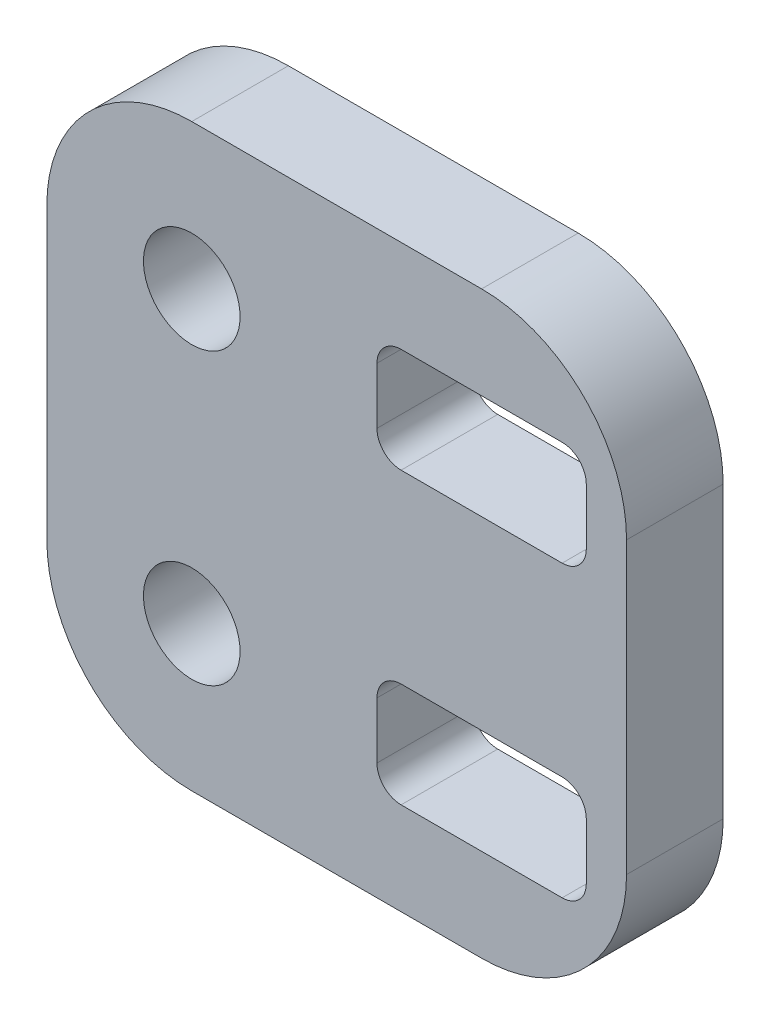
ISO-10303-21;
HEADER;
FILE_DESCRIPTION(('STEP AP214'),'2;1');
FILE_NAME('part.step','',(''),(''),'','','');
FILE_SCHEMA(('AUTOMOTIVE_DESIGN { 1 0 10303 214 1 1 1 1 }'));
ENDSEC;
DATA;
#1=APPLICATION_CONTEXT('core data for automotive mechanical design processes');
#2=APPLICATION_PROTOCOL_DEFINITION('international standard','automotive_design',2000,#1);
#3=PRODUCT_CONTEXT('',#1,'mechanical');
#4=PRODUCT('Part','Part','',(#3));
#5=PRODUCT_RELATED_PRODUCT_CATEGORY('part','',(#4));
#6=PRODUCT_DEFINITION_FORMATION('','',#4);
#7=PRODUCT_DEFINITION_CONTEXT('part definition',#1,'design');
#8=PRODUCT_DEFINITION('design','',#6,#7);
#9=PRODUCT_DEFINITION_SHAPE('','',#8);
#10=(LENGTH_UNIT() NAMED_UNIT(*) SI_UNIT(.MILLI.,.METRE.));
#11=(NAMED_UNIT(*) PLANE_ANGLE_UNIT() SI_UNIT($,.RADIAN.));
#12=(NAMED_UNIT(*) SI_UNIT($,.STERADIAN.) SOLID_ANGLE_UNIT());
#13=UNCERTAINTY_MEASURE_WITH_UNIT(LENGTH_MEASURE(1.E-05),#10,'distance_accuracy_value','');
#14=(GEOMETRIC_REPRESENTATION_CONTEXT(3) GLOBAL_UNCERTAINTY_ASSIGNED_CONTEXT((#13)) GLOBAL_UNIT_ASSIGNED_CONTEXT((#10,
#11,#12)) REPRESENTATION_CONTEXT('',''));
#15=CARTESIAN_POINT('',(0.,0.,0.));
#16=DIRECTION('',(0.,0.,1.));
#17=DIRECTION('',(1.,0.,0.));
#18=AXIS2_PLACEMENT_3D('',#15,#16,#17);
#19=CARTESIAN_POINT('',(204.3359221937,165.8331963046,3.));
#20=DIRECTION('',(0.,0.,1.));
#21=DIRECTION('',(1.,0.,0.));
#22=AXIS2_PLACEMENT_3D('',#19,#20,#21);
#23=PLANE('',#22);
#24=DIRECTION('',(1.,0.,0.));
#25=VECTOR('',#24,1.);
#26=CARTESIAN_POINT('',(206.8359221937,173.2081963046,3.));
#27=LINE('',#26,#25);
#28=CARTESIAN_POINT('',(201.8359221937,173.2081963046,3.));
#29=VERTEX_POINT('',#28);
#30=CARTESIAN_POINT('',(206.8359221937,173.2081963046,3.));
#31=VERTEX_POINT('',#30);
#32=EDGE_CURVE('E261',#29,#31,#27,.T.);
#33=ORIENTED_EDGE('',*,*,#32,.F.);
#34=CARTESIAN_POINT('',(201.8359221937,173.9581963046,3.));
#35=DIRECTION('',(0.,0.,1.));
#36=DIRECTION('',(1.,0.,0.));
#37=AXIS2_PLACEMENT_3D('',#34,#35,#36);
#38=CIRCLE('',#37,0.750000000000001);
#39=CARTESIAN_POINT('',(201.0859221937,173.9581963046,3.));
#40=VERTEX_POINT('',#39);
#41=EDGE_CURVE('E259',#40,#29,#38,.T.);
#42=ORIENTED_EDGE('',*,*,#41,.F.);
#43=DIRECTION('',(0.,-1.,0.));
#44=VECTOR('',#43,1.);
#45=CARTESIAN_POINT('',(201.0859221937,173.9581963046,3.));
#46=LINE('',#45,#44);
#47=CARTESIAN_POINT('',(201.0859221937,175.7081963046,3.));
#48=VERTEX_POINT('',#47);
#49=EDGE_CURVE('E275',#48,#40,#46,.T.);
#50=ORIENTED_EDGE('',*,*,#49,.F.);
#51=CARTESIAN_POINT('',(201.8359221937,175.7081963046,3.));
#52=DIRECTION('',(0.,0.,1.));
#53=DIRECTION('',(1.,0.,0.));
#54=AXIS2_PLACEMENT_3D('',#51,#52,#53);
#55=CIRCLE('',#54,0.750000000000001);
#56=CARTESIAN_POINT('',(201.8359221937,176.4581963046,3.));
#57=VERTEX_POINT('',#56);
#58=EDGE_CURVE('E272',#57,#48,#55,.T.);
#59=ORIENTED_EDGE('',*,*,#58,.F.);
#60=DIRECTION('',(-1.,0.,0.));
#61=VECTOR('',#60,1.);
#62=CARTESIAN_POINT('',(201.8359221937,176.4581963046,3.));
#63=LINE('',#62,#61);
#64=CARTESIAN_POINT('',(206.8359221937,176.4581963046,3.));
#65=VERTEX_POINT('',#64);
#66=EDGE_CURVE('E270',#65,#57,#63,.T.);
#67=ORIENTED_EDGE('',*,*,#66,.F.);
#68=CARTESIAN_POINT('',(206.8359221937,175.7081963046,3.));
#69=DIRECTION('',(0.,0.,1.));
#70=DIRECTION('',(1.,0.,0.));
#71=AXIS2_PLACEMENT_3D('',#68,#69,#70);
#72=CIRCLE('',#71,0.750000000000001);
#73=CARTESIAN_POINT('',(207.5859221937,175.7081963046,3.));
#74=VERTEX_POINT('',#73);
#75=EDGE_CURVE('E268',#74,#65,#72,.T.);
#76=ORIENTED_EDGE('',*,*,#75,.F.);
#77=DIRECTION('',(0.,1.,0.));
#78=VECTOR('',#77,1.);
#79=CARTESIAN_POINT('',(207.5859221937,175.7081963046,3.));
#80=LINE('',#79,#78);
#81=CARTESIAN_POINT('',(207.5859221937,173.9581963046,3.));
#82=VERTEX_POINT('',#81);
#83=EDGE_CURVE('E266',#82,#74,#80,.T.);
#84=ORIENTED_EDGE('',*,*,#83,.F.);
#85=CARTESIAN_POINT('',(206.8359221937,173.9581963046,3.));
#86=DIRECTION('',(0.,0.,1.));
#87=DIRECTION('',(1.,0.,0.));
#88=AXIS2_PLACEMENT_3D('',#85,#86,#87);
#89=CIRCLE('',#88,0.750000000000001);
#90=EDGE_CURVE('E264',#31,#82,#89,.T.);
#91=ORIENTED_EDGE('',*,*,#90,.F.);
#92=EDGE_LOOP('',(#33,#42,#50,#59,#67,#76,#84,#91));
#93=FACE_BOUND('',#92,.T.);
#94=CARTESIAN_POINT('',(195.3359221937,174.8331963046,3.));
#95=DIRECTION('',(0.,0.,1.));
#96=DIRECTION('',(1.,0.,0.));
#97=AXIS2_PLACEMENT_3D('',#94,#95,#96);
#98=CIRCLE('',#97,1.5);
#99=CARTESIAN_POINT('',(196.8359221937,174.8331963046,3.));
#100=VERTEX_POINT('',#99);
#101=EDGE_CURVE('E324',#100,#100,#98,.T.);
#102=ORIENTED_EDGE('',*,*,#101,.F.);
#103=EDGE_LOOP('',(#102));
#104=FACE_BOUND('',#103,.T.);
#105=CARTESIAN_POINT('',(204.3359221937,165.8331963046,3.));
#106=DIRECTION('',(0.,0.,1.));
#107=DIRECTION('',(1.,0.,0.));
#108=AXIS2_PLACEMENT_3D('',#105,#106,#107);
#109=CIRCLE('',#108,4.49999999999999);
#110=CARTESIAN_POINT('',(204.3359221937,161.3331963046,3.));
#111=VERTEX_POINT('',#110);
#112=CARTESIAN_POINT('',(208.8359221937,165.8331963046,3.));
#113=VERTEX_POINT('',#112);
#114=EDGE_CURVE('E330',#111,#113,#109,.T.);
#115=ORIENTED_EDGE('',*,*,#114,.T.);
#116=DIRECTION('',(0.,1.,0.));
#117=VECTOR('',#116,1.);
#118=CARTESIAN_POINT('',(208.8359221937,165.8331963046,3.));
#119=LINE('',#118,#117);
#120=CARTESIAN_POINT('',(208.8359221937,174.8331963046,3.));
#121=VERTEX_POINT('',#120);
#122=EDGE_CURVE('E333',#113,#121,#119,.T.);
#123=ORIENTED_EDGE('',*,*,#122,.T.);
#124=CARTESIAN_POINT('',(204.3359221937,174.8331963046,3.));
#125=DIRECTION('',(0.,0.,1.));
#126=DIRECTION('',(1.,0.,0.));
#127=AXIS2_PLACEMENT_3D('',#124,#125,#126);
#128=CIRCLE('',#127,4.49999999999998);
#129=CARTESIAN_POINT('',(204.3359221937,179.3331963046,3.));
#130=VERTEX_POINT('',#129);
#131=EDGE_CURVE('E336',#121,#130,#128,.T.);
#132=ORIENTED_EDGE('',*,*,#131,.T.);
#133=DIRECTION('',(-1.,0.,0.));
#134=VECTOR('',#133,1.);
#135=CARTESIAN_POINT('',(204.3359221937,179.3331963046,3.));
#136=LINE('',#135,#134);
#137=CARTESIAN_POINT('',(195.3359221937,179.3331963046,3.));
#138=VERTEX_POINT('',#137);
#139=EDGE_CURVE('E338',#130,#138,#136,.T.);
#140=ORIENTED_EDGE('',*,*,#139,.T.);
#141=CARTESIAN_POINT('',(195.3359221937,174.8331963046,3.));
#142=DIRECTION('',(0.,0.,1.));
#143=DIRECTION('',(1.,0.,0.));
#144=AXIS2_PLACEMENT_3D('',#141,#142,#143);
#145=CIRCLE('',#144,4.49999999999999);
#146=CARTESIAN_POINT('',(190.8359221937,174.8331963046,3.));
#147=VERTEX_POINT('',#146);
#148=EDGE_CURVE('E340',#138,#147,#145,.T.);
#149=ORIENTED_EDGE('',*,*,#148,.T.);
#150=DIRECTION('',(0.,-1.,0.));
#151=VECTOR('',#150,1.);
#152=CARTESIAN_POINT('',(190.8359221937,174.8331963046,3.));
#153=LINE('',#152,#151);
#154=CARTESIAN_POINT('',(190.8359221937,165.8331963046,3.));
#155=VERTEX_POINT('',#154);
#156=EDGE_CURVE('E342',#147,#155,#153,.T.);
#157=ORIENTED_EDGE('',*,*,#156,.T.);
#158=CARTESIAN_POINT('',(195.3359221937,165.8331963046,3.));
#159=DIRECTION('',(0.,0.,1.));
#160=DIRECTION('',(1.,0.,0.));
#161=AXIS2_PLACEMENT_3D('',#158,#159,#160);
#162=CIRCLE('',#161,4.5);
#163=CARTESIAN_POINT('',(195.3359221937,161.3331963046,3.));
#164=VERTEX_POINT('',#163);
#165=EDGE_CURVE('E344',#155,#164,#162,.T.);
#166=ORIENTED_EDGE('',*,*,#165,.T.);
#167=DIRECTION('',(1.,0.,0.));
#168=VECTOR('',#167,1.);
#169=CARTESIAN_POINT('',(195.3359221937,161.3331963046,3.));
#170=LINE('',#169,#168);
#171=EDGE_CURVE('E346',#164,#111,#170,.T.);
#172=ORIENTED_EDGE('',*,*,#171,.T.);
#173=EDGE_LOOP('',(#115,#123,#132,#140,#149,#157,#166,#172));
#174=FACE_BOUND('',#173,.T.);
#175=CARTESIAN_POINT('',(195.3359221937,165.8331963046,3.));
#176=DIRECTION('',(0.,0.,1.));
#177=DIRECTION('',(1.,0.,0.));
#178=AXIS2_PLACEMENT_3D('',#175,#176,#177);
#179=CIRCLE('',#178,1.5);
#180=CARTESIAN_POINT('',(196.8359221937,165.8331963046,3.));
#181=VERTEX_POINT('',#180);
#182=EDGE_CURVE('E318',#181,#181,#179,.T.);
#183=ORIENTED_EDGE('',*,*,#182,.F.);
#184=EDGE_LOOP('',(#183));
#185=FACE_BOUND('',#184,.T.);
#186=DIRECTION('',(1.,0.,0.));
#187=VECTOR('',#186,1.);
#188=CARTESIAN_POINT('',(206.8359221937,164.2081963046,3.));
#189=LINE('',#188,#187);
#190=CARTESIAN_POINT('',(201.8359221937,164.2081963046,3.));
#191=VERTEX_POINT('',#190);
#192=CARTESIAN_POINT('',(206.8359221937,164.2081963046,3.));
#193=VERTEX_POINT('',#192);
#194=EDGE_CURVE('E202',#191,#193,#189,.T.);
#195=ORIENTED_EDGE('',*,*,#194,.F.);
#196=CARTESIAN_POINT('',(201.8359221937,164.9581963046,3.));
#197=DIRECTION('',(0.,0.,1.));
#198=DIRECTION('',(1.,0.,0.));
#199=AXIS2_PLACEMENT_3D('',#196,#197,#198);
#200=CIRCLE('',#199,0.750000000000001);
#201=CARTESIAN_POINT('',(201.0859221937,164.9581963046,3.));
#202=VERTEX_POINT('',#201);
#203=EDGE_CURVE('E194',#202,#191,#200,.T.);
#204=ORIENTED_EDGE('',*,*,#203,.F.);
#205=DIRECTION('',(0.,-1.,0.));
#206=VECTOR('',#205,1.);
#207=CARTESIAN_POINT('',(201.0859221937,164.9581963046,3.));
#208=LINE('',#207,#206);
#209=CARTESIAN_POINT('',(201.0859221937,166.7081963046,3.));
#210=VERTEX_POINT('',#209);
#211=EDGE_CURVE('E227',#210,#202,#208,.T.);
#212=ORIENTED_EDGE('',*,*,#211,.F.);
#213=CARTESIAN_POINT('',(201.8359221937,166.7081963046,3.));
#214=DIRECTION('',(0.,0.,1.));
#215=DIRECTION('',(1.,0.,0.));
#216=AXIS2_PLACEMENT_3D('',#213,#214,#215);
#217=CIRCLE('',#216,0.750000000000001);
#218=CARTESIAN_POINT('',(201.8359221937,167.4581963046,3.));
#219=VERTEX_POINT('',#218);
#220=EDGE_CURVE('E225',#219,#210,#217,.T.);
#221=ORIENTED_EDGE('',*,*,#220,.F.);
#222=DIRECTION('',(-1.,0.,0.));
#223=VECTOR('',#222,1.);
#224=CARTESIAN_POINT('',(201.8359221937,167.4581963046,3.));
#225=LINE('',#224,#223);
#226=CARTESIAN_POINT('',(206.8359221937,167.4581963046,3.));
#227=VERTEX_POINT('',#226);
#228=EDGE_CURVE('E223',#227,#219,#225,.T.);
#229=ORIENTED_EDGE('',*,*,#228,.F.);
#230=CARTESIAN_POINT('',(206.8359221937,166.7081963046,3.));
#231=DIRECTION('',(0.,0.,1.));
#232=DIRECTION('',(1.,0.,0.));
#233=AXIS2_PLACEMENT_3D('',#230,#231,#232);
#234=CIRCLE('',#233,0.750000000000001);
#235=CARTESIAN_POINT('',(207.5859221937,166.7081963046,3.));
#236=VERTEX_POINT('',#235);
#237=EDGE_CURVE('E221',#236,#227,#234,.T.);
#238=ORIENTED_EDGE('',*,*,#237,.F.);
#239=DIRECTION('',(0.,1.,0.));
#240=VECTOR('',#239,1.);
#241=CARTESIAN_POINT('',(207.5859221937,166.7081963046,3.));
#242=LINE('',#241,#240);
#243=CARTESIAN_POINT('',(207.5859221937,164.9581963046,3.));
#244=VERTEX_POINT('',#243);
#245=EDGE_CURVE('E217',#244,#236,#242,.T.);
#246=ORIENTED_EDGE('',*,*,#245,.F.);
#247=CARTESIAN_POINT('',(206.8359221937,164.9581963046,3.));
#248=DIRECTION('',(0.,0.,1.));
#249=DIRECTION('',(1.,0.,0.));
#250=AXIS2_PLACEMENT_3D('',#247,#248,#249);
#251=CIRCLE('',#250,0.750000000000001);
#252=EDGE_CURVE('E215',#193,#244,#251,.T.);
#253=ORIENTED_EDGE('',*,*,#252,.F.);
#254=EDGE_LOOP('',(#195,#204,#212,#221,#229,#238,#246,#253));
#255=FACE_BOUND('',#254,.T.);
#256=ADVANCED_FACE('F33',(#93,#104,#174,#185,#255),#23,.T.);
#257=CARTESIAN_POINT('',(204.3359221937,165.8331963046,0.));
#258=DIRECTION('',(0.,0.,1.));
#259=DIRECTION('',(1.,0.,0.));
#260=AXIS2_PLACEMENT_3D('',#257,#258,#259);
#261=PLANE('',#260);
#262=CARTESIAN_POINT('',(201.8359221937,173.9581963046,0.));
#263=DIRECTION('',(0.,0.,1.));
#264=DIRECTION('',(1.,0.,0.));
#265=AXIS2_PLACEMENT_3D('',#262,#263,#264);
#266=CIRCLE('',#265,0.750000000000001);
#267=CARTESIAN_POINT('',(201.0859221937,173.9581963046,0.));
#268=VERTEX_POINT('',#267);
#269=CARTESIAN_POINT('',(201.8359221937,173.2081963046,0.));
#270=VERTEX_POINT('',#269);
#271=EDGE_CURVE('E210',#268,#270,#266,.T.);
#272=ORIENTED_EDGE('',*,*,#271,.T.);
#273=DIRECTION('',(1.,0.,0.));
#274=VECTOR('',#273,1.);
#275=CARTESIAN_POINT('',(206.8359221937,173.2081963046,0.));
#276=LINE('',#275,#274);
#277=CARTESIAN_POINT('',(206.8359221937,173.2081963046,0.));
#278=VERTEX_POINT('',#277);
#279=EDGE_CURVE('E280',#270,#278,#276,.T.);
#280=ORIENTED_EDGE('',*,*,#279,.T.);
#281=CARTESIAN_POINT('',(206.8359221937,173.9581963046,0.));
#282=DIRECTION('',(0.,0.,1.));
#283=DIRECTION('',(1.,0.,0.));
#284=AXIS2_PLACEMENT_3D('',#281,#282,#283);
#285=CIRCLE('',#284,0.750000000000001);
#286=CARTESIAN_POINT('',(207.5859221937,173.9581963046,0.));
#287=VERTEX_POINT('',#286);
#288=EDGE_CURVE('E283',#278,#287,#285,.T.);
#289=ORIENTED_EDGE('',*,*,#288,.T.);
#290=DIRECTION('',(0.,1.,0.));
#291=VECTOR('',#290,1.);
#292=CARTESIAN_POINT('',(207.5859221937,175.7081963046,0.));
#293=LINE('',#292,#291);
#294=CARTESIAN_POINT('',(207.5859221937,175.7081963046,0.));
#295=VERTEX_POINT('',#294);
#296=EDGE_CURVE('E286',#287,#295,#293,.T.);
#297=ORIENTED_EDGE('',*,*,#296,.T.);
#298=CARTESIAN_POINT('',(206.8359221937,175.7081963046,0.));
#299=DIRECTION('',(0.,0.,1.));
#300=DIRECTION('',(1.,0.,0.));
#301=AXIS2_PLACEMENT_3D('',#298,#299,#300);
#302=CIRCLE('',#301,0.750000000000001);
#303=CARTESIAN_POINT('',(206.8359221937,176.4581963046,0.));
#304=VERTEX_POINT('',#303);
#305=EDGE_CURVE('E289',#295,#304,#302,.T.);
#306=ORIENTED_EDGE('',*,*,#305,.T.);
#307=DIRECTION('',(-1.,0.,0.));
#308=VECTOR('',#307,1.);
#309=CARTESIAN_POINT('',(201.8359221937,176.4581963046,0.));
#310=LINE('',#309,#308);
#311=CARTESIAN_POINT('',(201.8359221937,176.4581963046,0.));
#312=VERTEX_POINT('',#311);
#313=EDGE_CURVE('E292',#304,#312,#310,.T.);
#314=ORIENTED_EDGE('',*,*,#313,.T.);
#315=CARTESIAN_POINT('',(201.8359221937,175.7081963046,0.));
#316=DIRECTION('',(0.,0.,1.));
#317=DIRECTION('',(1.,0.,0.));
#318=AXIS2_PLACEMENT_3D('',#315,#316,#317);
#319=CIRCLE('',#318,0.750000000000001);
#320=CARTESIAN_POINT('',(201.0859221937,175.7081963046,0.));
#321=VERTEX_POINT('',#320);
#322=EDGE_CURVE('E295',#312,#321,#319,.T.);
#323=ORIENTED_EDGE('',*,*,#322,.T.);
#324=DIRECTION('',(0.,-1.,0.));
#325=VECTOR('',#324,1.);
#326=CARTESIAN_POINT('',(201.0859221937,173.9581963046,0.));
#327=LINE('',#326,#325);
#328=EDGE_CURVE('E262',#321,#268,#327,.T.);
#329=ORIENTED_EDGE('',*,*,#328,.T.);
#330=EDGE_LOOP('',(#272,#280,#289,#297,#306,#314,#323,#329));
#331=FACE_BOUND('',#330,.T.);
#332=CARTESIAN_POINT('',(195.3359221937,174.8331963046,0.));
#333=DIRECTION('',(0.,0.,1.));
#334=DIRECTION('',(1.,0.,0.));
#335=AXIS2_PLACEMENT_3D('',#332,#333,#334);
#336=CIRCLE('',#335,1.5);
#337=CARTESIAN_POINT('',(196.8359221937,174.8331963046,0.));
#338=VERTEX_POINT('',#337);
#339=EDGE_CURVE('E321',#338,#338,#336,.T.);
#340=ORIENTED_EDGE('',*,*,#339,.T.);
#341=EDGE_LOOP('',(#340));
#342=FACE_BOUND('',#341,.T.);
#343=CARTESIAN_POINT('',(204.3359221937,165.8331963046,0.));
#344=DIRECTION('',(0.,0.,1.));
#345=DIRECTION('',(1.,0.,0.));
#346=AXIS2_PLACEMENT_3D('',#343,#344,#345);
#347=CIRCLE('',#346,4.49999999999999);
#348=CARTESIAN_POINT('',(204.3359221937,161.3331963046,0.));
#349=VERTEX_POINT('',#348);
#350=CARTESIAN_POINT('',(208.8359221937,165.8331963046,0.));
#351=VERTEX_POINT('',#350);
#352=EDGE_CURVE('E327',#349,#351,#347,.T.);
#353=ORIENTED_EDGE('',*,*,#352,.F.);
#354=DIRECTION('',(1.,0.,0.));
#355=VECTOR('',#354,1.);
#356=CARTESIAN_POINT('',(195.3359221937,161.3331963046,0.));
#357=LINE('',#356,#355);
#358=CARTESIAN_POINT('',(195.3359221937,161.3331963046,0.));
#359=VERTEX_POINT('',#358);
#360=EDGE_CURVE('E334',#359,#349,#357,.T.);
#361=ORIENTED_EDGE('',*,*,#360,.F.);
#362=CARTESIAN_POINT('',(195.3359221937,165.8331963046,0.));
#363=DIRECTION('',(0.,0.,1.));
#364=DIRECTION('',(1.,0.,0.));
#365=AXIS2_PLACEMENT_3D('',#362,#363,#364);
#366=CIRCLE('',#365,4.5);
#367=CARTESIAN_POINT('',(190.8359221937,165.8331963046,0.));
#368=VERTEX_POINT('',#367);
#369=EDGE_CURVE('E361',#368,#359,#366,.T.);
#370=ORIENTED_EDGE('',*,*,#369,.F.);
#371=DIRECTION('',(0.,-1.,0.));
#372=VECTOR('',#371,1.);
#373=CARTESIAN_POINT('',(190.8359221937,174.8331963046,0.));
#374=LINE('',#373,#372);
#375=CARTESIAN_POINT('',(190.8359221937,174.8331963046,0.));
#376=VERTEX_POINT('',#375);
#377=EDGE_CURVE('E359',#376,#368,#374,.T.);
#378=ORIENTED_EDGE('',*,*,#377,.F.);
#379=CARTESIAN_POINT('',(195.3359221937,174.8331963046,0.));
#380=DIRECTION('',(0.,0.,1.));
#381=DIRECTION('',(1.,0.,0.));
#382=AXIS2_PLACEMENT_3D('',#379,#380,#381);
#383=CIRCLE('',#382,4.49999999999999);
#384=CARTESIAN_POINT('',(195.3359221937,179.3331963046,0.));
#385=VERTEX_POINT('',#384);
#386=EDGE_CURVE('E357',#385,#376,#383,.T.);
#387=ORIENTED_EDGE('',*,*,#386,.F.);
#388=DIRECTION('',(-1.,0.,0.));
#389=VECTOR('',#388,1.);
#390=CARTESIAN_POINT('',(204.3359221937,179.3331963046,0.));
#391=LINE('',#390,#389);
#392=CARTESIAN_POINT('',(204.3359221937,179.3331963046,0.));
#393=VERTEX_POINT('',#392);
#394=EDGE_CURVE('E355',#393,#385,#391,.T.);
#395=ORIENTED_EDGE('',*,*,#394,.F.);
#396=CARTESIAN_POINT('',(204.3359221937,174.8331963046,0.));
#397=DIRECTION('',(0.,0.,1.));
#398=DIRECTION('',(1.,0.,0.));
#399=AXIS2_PLACEMENT_3D('',#396,#397,#398);
#400=CIRCLE('',#399,4.49999999999998);
#401=CARTESIAN_POINT('',(208.8359221937,174.8331963046,0.));
#402=VERTEX_POINT('',#401);
#403=EDGE_CURVE('E353',#402,#393,#400,.T.);
#404=ORIENTED_EDGE('',*,*,#403,.F.);
#405=DIRECTION('',(0.,1.,0.));
#406=VECTOR('',#405,1.);
#407=CARTESIAN_POINT('',(208.8359221937,165.8331963046,0.));
#408=LINE('',#407,#406);
#409=EDGE_CURVE('E351',#351,#402,#408,.T.);
#410=ORIENTED_EDGE('',*,*,#409,.F.);
#411=EDGE_LOOP('',(#353,#361,#370,#378,#387,#395,#404,#410));
#412=FACE_BOUND('',#411,.T.);
#413=CARTESIAN_POINT('',(195.3359221937,165.8331963046,0.));
#414=DIRECTION('',(0.,0.,1.));
#415=DIRECTION('',(1.,0.,0.));
#416=AXIS2_PLACEMENT_3D('',#413,#414,#415);
#417=CIRCLE('',#416,1.5);
#418=CARTESIAN_POINT('',(196.8359221937,165.8331963046,0.));
#419=VERTEX_POINT('',#418);
#420=EDGE_CURVE('E317',#419,#419,#417,.T.);
#421=ORIENTED_EDGE('',*,*,#420,.T.);
#422=EDGE_LOOP('',(#421));
#423=FACE_BOUND('',#422,.T.);
#424=CARTESIAN_POINT('',(201.8359221937,164.9581963046,0.));
#425=DIRECTION('',(0.,0.,1.));
#426=DIRECTION('',(1.,0.,0.));
#427=AXIS2_PLACEMENT_3D('',#424,#425,#426);
#428=CIRCLE('',#427,0.750000000000001);
#429=CARTESIAN_POINT('',(201.0859221937,164.9581963046,0.));
#430=VERTEX_POINT('',#429);
#431=CARTESIAN_POINT('',(201.8359221937,164.2081963046,0.));
#432=VERTEX_POINT('',#431);
#433=EDGE_CURVE('E56',#430,#432,#428,.T.);
#434=ORIENTED_EDGE('',*,*,#433,.T.);
#435=DIRECTION('',(1.,0.,0.));
#436=VECTOR('',#435,1.);
#437=CARTESIAN_POINT('',(206.8359221937,164.2081963046,0.));
#438=LINE('',#437,#436);
#439=CARTESIAN_POINT('',(206.8359221937,164.2081963046,0.));
#440=VERTEX_POINT('',#439);
#441=EDGE_CURVE('E209',#432,#440,#438,.T.);
#442=ORIENTED_EDGE('',*,*,#441,.T.);
#443=CARTESIAN_POINT('',(206.8359221937,164.9581963046,0.));
#444=DIRECTION('',(0.,0.,1.));
#445=DIRECTION('',(1.,0.,0.));
#446=AXIS2_PLACEMENT_3D('',#443,#444,#445);
#447=CIRCLE('',#446,0.750000000000001);
#448=CARTESIAN_POINT('',(207.5859221937,164.9581963046,0.));
#449=VERTEX_POINT('',#448);
#450=EDGE_CURVE('E231',#440,#449,#447,.T.);
#451=ORIENTED_EDGE('',*,*,#450,.T.);
#452=DIRECTION('',(0.,1.,0.));
#453=VECTOR('',#452,1.);
#454=CARTESIAN_POINT('',(207.5859221937,166.7081963046,0.));
#455=LINE('',#454,#453);
#456=CARTESIAN_POINT('',(207.5859221937,166.7081963046,0.));
#457=VERTEX_POINT('',#456);
#458=EDGE_CURVE('E234',#449,#457,#455,.T.);
#459=ORIENTED_EDGE('',*,*,#458,.T.);
#460=CARTESIAN_POINT('',(206.8359221937,166.7081963046,0.));
#461=DIRECTION('',(0.,0.,1.));
#462=DIRECTION('',(1.,0.,0.));
#463=AXIS2_PLACEMENT_3D('',#460,#461,#462);
#464=CIRCLE('',#463,0.750000000000001);
#465=CARTESIAN_POINT('',(206.8359221937,167.4581963046,0.));
#466=VERTEX_POINT('',#465);
#467=EDGE_CURVE('E237',#457,#466,#464,.T.);
#468=ORIENTED_EDGE('',*,*,#467,.T.);
#469=DIRECTION('',(-1.,0.,0.));
#470=VECTOR('',#469,1.);
#471=CARTESIAN_POINT('',(201.8359221937,167.4581963046,0.));
#472=LINE('',#471,#470);
#473=CARTESIAN_POINT('',(201.8359221937,167.4581963046,0.));
#474=VERTEX_POINT('',#473);
#475=EDGE_CURVE('E240',#466,#474,#472,.T.);
#476=ORIENTED_EDGE('',*,*,#475,.T.);
#477=CARTESIAN_POINT('',(201.8359221937,166.7081963046,0.));
#478=DIRECTION('',(0.,0.,1.));
#479=DIRECTION('',(1.,0.,0.));
#480=AXIS2_PLACEMENT_3D('',#477,#478,#479);
#481=CIRCLE('',#480,0.750000000000001);
#482=CARTESIAN_POINT('',(201.0859221937,166.7081963046,0.));
#483=VERTEX_POINT('',#482);
#484=EDGE_CURVE('E243',#474,#483,#481,.T.);
#485=ORIENTED_EDGE('',*,*,#484,.T.);
#486=DIRECTION('',(0.,-1.,0.));
#487=VECTOR('',#486,1.);
#488=CARTESIAN_POINT('',(201.0859221937,164.9581963046,0.));
#489=LINE('',#488,#487);
#490=EDGE_CURVE('E203',#483,#430,#489,.T.);
#491=ORIENTED_EDGE('',*,*,#490,.T.);
#492=EDGE_LOOP('',(#434,#442,#451,#459,#468,#476,#485,#491));
#493=FACE_BOUND('',#492,.T.);
#494=ADVANCED_FACE('F391',(#331,#342,#412,#423,#493),#261,.F.);
#495=CARTESIAN_POINT('',(204.3359221937,165.8331963046,3.));
#496=DIRECTION('',(0.,0.,-1.));
#497=DIRECTION('',(-1.,0.,0.));
#498=AXIS2_PLACEMENT_3D('',#495,#496,#497);
#499=CYLINDRICAL_SURFACE('',#498,4.49999999999999);
#500=ORIENTED_EDGE('',*,*,#352,.T.);
#501=DIRECTION('',(0.,0.,-1.));
#502=VECTOR('',#501,1.);
#503=CARTESIAN_POINT('',(208.8359221937,165.8331963046,3.));
#504=LINE('',#503,#502);
#505=EDGE_CURVE('E11',#113,#351,#504,.T.);
#506=ORIENTED_EDGE('',*,*,#505,.F.);
#507=ORIENTED_EDGE('',*,*,#114,.F.);
#508=DIRECTION('',(0.,0.,-1.));
#509=VECTOR('',#508,1.);
#510=CARTESIAN_POINT('',(204.3359221937,161.3331963046,3.));
#511=LINE('',#510,#509);
#512=EDGE_CURVE('E348',#111,#349,#511,.T.);
#513=ORIENTED_EDGE('',*,*,#512,.T.);
#514=EDGE_LOOP('',(#500,#506,#507,#513));
#515=FACE_BOUND('',#514,.T.);
#516=ADVANCED_FACE('F35',(#515),#499,.T.);
#517=CARTESIAN_POINT('',(208.8359221937,165.8331963046,3.));
#518=DIRECTION('',(-1.,0.,0.));
#519=DIRECTION('',(0.,0.,1.));
#520=AXIS2_PLACEMENT_3D('',#517,#518,#519);
#521=PLANE('',#520);
#522=ORIENTED_EDGE('',*,*,#409,.T.);
#523=DIRECTION('',(0.,0.,-1.));
#524=VECTOR('',#523,1.);
#525=CARTESIAN_POINT('',(208.8359221937,174.8331963046,3.));
#526=LINE('',#525,#524);
#527=EDGE_CURVE('E41',#121,#402,#526,.T.);
#528=ORIENTED_EDGE('',*,*,#527,.F.);
#529=ORIENTED_EDGE('',*,*,#122,.F.);
#530=ORIENTED_EDGE('',*,*,#505,.T.);
#531=EDGE_LOOP('',(#522,#528,#529,#530));
#532=FACE_BOUND('',#531,.T.);
#533=ADVANCED_FACE('F409',(#532),#521,.F.);
#534=CARTESIAN_POINT('',(204.3359221937,174.8331963046,3.));
#535=DIRECTION('',(0.,0.,-1.));
#536=DIRECTION('',(-1.,0.,0.));
#537=AXIS2_PLACEMENT_3D('',#534,#535,#536);
#538=CYLINDRICAL_SURFACE('',#537,4.49999999999998);
#539=ORIENTED_EDGE('',*,*,#403,.T.);
#540=DIRECTION('',(0.,0.,-1.));
#541=VECTOR('',#540,1.);
#542=CARTESIAN_POINT('',(204.3359221937,179.3331963046,3.));
#543=LINE('',#542,#541);
#544=EDGE_CURVE('E378',#130,#393,#543,.T.);
#545=ORIENTED_EDGE('',*,*,#544,.F.);
#546=ORIENTED_EDGE('',*,*,#131,.F.);
#547=ORIENTED_EDGE('',*,*,#527,.T.);
#548=EDGE_LOOP('',(#539,#545,#546,#547));
#549=FACE_BOUND('',#548,.T.);
#550=ADVANCED_FACE('F385',(#549),#538,.T.);
#551=CARTESIAN_POINT('',(204.3359221937,179.3331963046,3.));
#552=DIRECTION('',(0.,-1.,0.));
#553=DIRECTION('',(0.,0.,-1.));
#554=AXIS2_PLACEMENT_3D('',#551,#552,#553);
#555=PLANE('',#554);
#556=ORIENTED_EDGE('',*,*,#394,.T.);
#557=DIRECTION('',(0.,0.,-1.));
#558=VECTOR('',#557,1.);
#559=CARTESIAN_POINT('',(195.3359221937,179.3331963046,3.));
#560=LINE('',#559,#558);
#561=EDGE_CURVE('E375',#138,#385,#560,.T.);
#562=ORIENTED_EDGE('',*,*,#561,.F.);
#563=ORIENTED_EDGE('',*,*,#139,.F.);
#564=ORIENTED_EDGE('',*,*,#544,.T.);
#565=EDGE_LOOP('',(#556,#562,#563,#564));
#566=FACE_BOUND('',#565,.T.);
#567=ADVANCED_FACE('F397',(#566),#555,.F.);
#568=CARTESIAN_POINT('',(195.3359221937,174.8331963046,3.));
#569=DIRECTION('',(0.,0.,-1.));
#570=DIRECTION('',(-1.,0.,0.));
#571=AXIS2_PLACEMENT_3D('',#568,#569,#570);
#572=CYLINDRICAL_SURFACE('',#571,4.49999999999999);
#573=ORIENTED_EDGE('',*,*,#386,.T.);
#574=DIRECTION('',(0.,0.,-1.));
#575=VECTOR('',#574,1.);
#576=CARTESIAN_POINT('',(190.8359221937,174.8331963046,3.));
#577=LINE('',#576,#575);
#578=EDGE_CURVE('E372',#147,#376,#577,.T.);
#579=ORIENTED_EDGE('',*,*,#578,.F.);
#580=ORIENTED_EDGE('',*,*,#148,.F.);
#581=ORIENTED_EDGE('',*,*,#561,.T.);
#582=EDGE_LOOP('',(#573,#579,#580,#581));
#583=FACE_BOUND('',#582,.T.);
#584=ADVANCED_FACE('F401',(#583),#572,.T.);
#585=CARTESIAN_POINT('',(190.8359221937,174.8331963046,3.));
#586=DIRECTION('',(1.,0.,0.));
#587=DIRECTION('',(0.,0.,-1.));
#588=AXIS2_PLACEMENT_3D('',#585,#586,#587);
#589=PLANE('',#588);
#590=ORIENTED_EDGE('',*,*,#377,.T.);
#591=DIRECTION('',(0.,0.,-1.));
#592=VECTOR('',#591,1.);
#593=CARTESIAN_POINT('',(190.8359221937,165.8331963046,3.));
#594=LINE('',#593,#592);
#595=EDGE_CURVE('E369',#155,#368,#594,.T.);
#596=ORIENTED_EDGE('',*,*,#595,.F.);
#597=ORIENTED_EDGE('',*,*,#156,.F.);
#598=ORIENTED_EDGE('',*,*,#578,.T.);
#599=EDGE_LOOP('',(#590,#596,#597,#598));
#600=FACE_BOUND('',#599,.T.);
#601=ADVANCED_FACE('F422',(#600),#589,.F.);
#602=CARTESIAN_POINT('',(195.3359221937,165.8331963046,3.));
#603=DIRECTION('',(0.,0.,-1.));
#604=DIRECTION('',(-1.,0.,0.));
#605=AXIS2_PLACEMENT_3D('',#602,#603,#604);
#606=CYLINDRICAL_SURFACE('',#605,4.5);
#607=ORIENTED_EDGE('',*,*,#369,.T.);
#608=DIRECTION('',(0.,0.,-1.));
#609=VECTOR('',#608,1.);
#610=CARTESIAN_POINT('',(195.3359221937,161.3331963046,3.));
#611=LINE('',#610,#609);
#612=EDGE_CURVE('E366',#164,#359,#611,.T.);
#613=ORIENTED_EDGE('',*,*,#612,.F.);
#614=ORIENTED_EDGE('',*,*,#165,.F.);
#615=ORIENTED_EDGE('',*,*,#595,.T.);
#616=EDGE_LOOP('',(#607,#613,#614,#615));
#617=FACE_BOUND('',#616,.T.);
#618=ADVANCED_FACE('F420',(#617),#606,.T.);
#619=CARTESIAN_POINT('',(195.3359221937,161.3331963046,3.));
#620=DIRECTION('',(0.,1.,0.));
#621=DIRECTION('',(0.,0.,1.));
#622=AXIS2_PLACEMENT_3D('',#619,#620,#621);
#623=PLANE('',#622);
#624=ORIENTED_EDGE('',*,*,#360,.T.);
#625=ORIENTED_EDGE('',*,*,#512,.F.);
#626=ORIENTED_EDGE('',*,*,#171,.F.);
#627=ORIENTED_EDGE('',*,*,#612,.T.);
#628=EDGE_LOOP('',(#624,#625,#626,#627));
#629=FACE_BOUND('',#628,.T.);
#630=ADVANCED_FACE('F415',(#629),#623,.F.);
#631=CARTESIAN_POINT('',(195.3359221937,174.8331963046,3.));
#632=DIRECTION('',(0.,0.,-1.));
#633=DIRECTION('',(-1.,0.,0.));
#634=AXIS2_PLACEMENT_3D('',#631,#632,#633);
#635=CYLINDRICAL_SURFACE('',#634,1.5);
#636=ORIENTED_EDGE('',*,*,#101,.T.);
#637=EDGE_LOOP('',(#636));
#638=FACE_BOUND('',#637,.T.);
#639=ORIENTED_EDGE('',*,*,#339,.F.);
#640=EDGE_LOOP('',(#639));
#641=FACE_BOUND('',#640,.T.);
#642=ADVANCED_FACE('F442',(#638,#641),#635,.F.);
#643=CARTESIAN_POINT('',(195.3359221937,165.8331963046,3.));
#644=DIRECTION('',(0.,0.,-1.));
#645=DIRECTION('',(-1.,0.,0.));
#646=AXIS2_PLACEMENT_3D('',#643,#644,#645);
#647=CYLINDRICAL_SURFACE('',#646,1.5);
#648=ORIENTED_EDGE('',*,*,#182,.T.);
#649=EDGE_LOOP('',(#648));
#650=FACE_BOUND('',#649,.T.);
#651=ORIENTED_EDGE('',*,*,#420,.F.);
#652=EDGE_LOOP('',(#651));
#653=FACE_BOUND('',#652,.T.);
#654=ADVANCED_FACE('F449',(#650,#653),#647,.F.);
#655=CARTESIAN_POINT('',(201.8359221937,173.9581963046,3.));
#656=DIRECTION('',(0.,0.,-1.));
#657=DIRECTION('',(-1.,0.,0.));
#658=AXIS2_PLACEMENT_3D('',#655,#656,#657);
#659=CYLINDRICAL_SURFACE('',#658,0.750000000000001);
#660=ORIENTED_EDGE('',*,*,#271,.F.);
#661=DIRECTION('',(0.,0.,-1.));
#662=VECTOR('',#661,1.);
#663=CARTESIAN_POINT('',(201.0859221937,173.9581963046,3.));
#664=LINE('',#663,#662);
#665=EDGE_CURVE('E277',#40,#268,#664,.T.);
#666=ORIENTED_EDGE('',*,*,#665,.F.);
#667=ORIENTED_EDGE('',*,*,#41,.T.);
#668=DIRECTION('',(0.,0.,-1.));
#669=VECTOR('',#668,1.);
#670=CARTESIAN_POINT('',(201.8359221937,173.2081963046,3.));
#671=LINE('',#670,#669);
#672=EDGE_CURVE('E314',#29,#270,#671,.T.);
#673=ORIENTED_EDGE('',*,*,#672,.T.);
#674=EDGE_LOOP('',(#660,#666,#667,#673));
#675=FACE_BOUND('',#674,.T.);
#676=ADVANCED_FACE('F454',(#675),#659,.F.);
#677=CARTESIAN_POINT('',(206.8359221937,173.2081963046,3.));
#678=DIRECTION('',(0.,1.,0.));
#679=DIRECTION('',(0.,0.,1.));
#680=AXIS2_PLACEMENT_3D('',#677,#678,#679);
#681=PLANE('',#680);
#682=ORIENTED_EDGE('',*,*,#279,.F.);
#683=ORIENTED_EDGE('',*,*,#672,.F.);
#684=ORIENTED_EDGE('',*,*,#32,.T.);
#685=DIRECTION('',(0.,0.,-1.));
#686=VECTOR('',#685,1.);
#687=CARTESIAN_POINT('',(206.8359221937,173.2081963046,3.));
#688=LINE('',#687,#686);
#689=EDGE_CURVE('E312',#31,#278,#688,.T.);
#690=ORIENTED_EDGE('',*,*,#689,.T.);
#691=EDGE_LOOP('',(#682,#683,#684,#690));
#692=FACE_BOUND('',#691,.T.);
#693=ADVANCED_FACE('F463',(#692),#681,.T.);
#694=CARTESIAN_POINT('',(206.8359221937,173.9581963046,3.));
#695=DIRECTION('',(0.,0.,-1.));
#696=DIRECTION('',(-1.,0.,0.));
#697=AXIS2_PLACEMENT_3D('',#694,#695,#696);
#698=CYLINDRICAL_SURFACE('',#697,0.750000000000001);
#699=ORIENTED_EDGE('',*,*,#288,.F.);
#700=ORIENTED_EDGE('',*,*,#689,.F.);
#701=ORIENTED_EDGE('',*,*,#90,.T.);
#702=DIRECTION('',(0.,0.,-1.));
#703=VECTOR('',#702,1.);
#704=CARTESIAN_POINT('',(207.5859221937,173.9581963046,3.));
#705=LINE('',#704,#703);
#706=EDGE_CURVE('E310',#82,#287,#705,.T.);
#707=ORIENTED_EDGE('',*,*,#706,.T.);
#708=EDGE_LOOP('',(#699,#700,#701,#707));
#709=FACE_BOUND('',#708,.T.);
#710=ADVANCED_FACE('F470',(#709),#698,.F.);
#711=CARTESIAN_POINT('',(207.5859221937,175.7081963046,3.));
#712=DIRECTION('',(-1.,0.,0.));
#713=DIRECTION('',(0.,0.,1.));
#714=AXIS2_PLACEMENT_3D('',#711,#712,#713);
#715=PLANE('',#714);
#716=ORIENTED_EDGE('',*,*,#296,.F.);
#717=ORIENTED_EDGE('',*,*,#706,.F.);
#718=ORIENTED_EDGE('',*,*,#83,.T.);
#719=DIRECTION('',(0.,0.,-1.));
#720=VECTOR('',#719,1.);
#721=CARTESIAN_POINT('',(207.5859221937,175.7081963046,3.));
#722=LINE('',#721,#720);
#723=EDGE_CURVE('E308',#74,#295,#722,.T.);
#724=ORIENTED_EDGE('',*,*,#723,.T.);
#725=EDGE_LOOP('',(#716,#717,#718,#724));
#726=FACE_BOUND('',#725,.T.);
#727=ADVANCED_FACE('F474',(#726),#715,.T.);
#728=CARTESIAN_POINT('',(206.8359221937,175.7081963046,3.));
#729=DIRECTION('',(0.,0.,-1.));
#730=DIRECTION('',(-1.,0.,0.));
#731=AXIS2_PLACEMENT_3D('',#728,#729,#730);
#732=CYLINDRICAL_SURFACE('',#731,0.750000000000001);
#733=ORIENTED_EDGE('',*,*,#305,.F.);
#734=ORIENTED_EDGE('',*,*,#723,.F.);
#735=ORIENTED_EDGE('',*,*,#75,.T.);
#736=DIRECTION('',(0.,0.,-1.));
#737=VECTOR('',#736,1.);
#738=CARTESIAN_POINT('',(206.8359221937,176.4581963046,3.));
#739=LINE('',#738,#737);
#740=EDGE_CURVE('E306',#65,#304,#739,.T.);
#741=ORIENTED_EDGE('',*,*,#740,.T.);
#742=EDGE_LOOP('',(#733,#734,#735,#741));
#743=FACE_BOUND('',#742,.T.);
#744=ADVANCED_FACE('F478',(#743),#732,.F.);
#745=CARTESIAN_POINT('',(201.8359221937,176.4581963046,3.));
#746=DIRECTION('',(0.,-1.,0.));
#747=DIRECTION('',(0.,0.,-1.));
#748=AXIS2_PLACEMENT_3D('',#745,#746,#747);
#749=PLANE('',#748);
#750=ORIENTED_EDGE('',*,*,#313,.F.);
#751=ORIENTED_EDGE('',*,*,#740,.F.);
#752=ORIENTED_EDGE('',*,*,#66,.T.);
#753=DIRECTION('',(0.,0.,-1.));
#754=VECTOR('',#753,1.);
#755=CARTESIAN_POINT('',(201.8359221937,176.4581963046,3.));
#756=LINE('',#755,#754);
#757=EDGE_CURVE('E304',#57,#312,#756,.T.);
#758=ORIENTED_EDGE('',*,*,#757,.T.);
#759=EDGE_LOOP('',(#750,#751,#752,#758));
#760=FACE_BOUND('',#759,.T.);
#761=ADVANCED_FACE('F482',(#760),#749,.T.);
#762=CARTESIAN_POINT('',(201.8359221937,175.7081963046,3.));
#763=DIRECTION('',(0.,0.,-1.));
#764=DIRECTION('',(-1.,0.,0.));
#765=AXIS2_PLACEMENT_3D('',#762,#763,#764);
#766=CYLINDRICAL_SURFACE('',#765,0.750000000000001);
#767=ORIENTED_EDGE('',*,*,#322,.F.);
#768=ORIENTED_EDGE('',*,*,#757,.F.);
#769=ORIENTED_EDGE('',*,*,#58,.T.);
#770=DIRECTION('',(0.,0.,-1.));
#771=VECTOR('',#770,1.);
#772=CARTESIAN_POINT('',(201.0859221937,175.7081963046,3.));
#773=LINE('',#772,#771);
#774=EDGE_CURVE('E302',#48,#321,#773,.T.);
#775=ORIENTED_EDGE('',*,*,#774,.T.);
#776=EDGE_LOOP('',(#767,#768,#769,#775));
#777=FACE_BOUND('',#776,.T.);
#778=ADVANCED_FACE('F486',(#777),#766,.F.);
#779=CARTESIAN_POINT('',(201.0859221937,173.9581963046,3.));
#780=DIRECTION('',(1.,0.,0.));
#781=DIRECTION('',(0.,0.,-1.));
#782=AXIS2_PLACEMENT_3D('',#779,#780,#781);
#783=PLANE('',#782);
#784=ORIENTED_EDGE('',*,*,#328,.F.);
#785=ORIENTED_EDGE('',*,*,#774,.F.);
#786=ORIENTED_EDGE('',*,*,#49,.T.);
#787=ORIENTED_EDGE('',*,*,#665,.T.);
#788=EDGE_LOOP('',(#784,#785,#786,#787));
#789=FACE_BOUND('',#788,.T.);
#790=ADVANCED_FACE('F490',(#789),#783,.T.);
#791=CARTESIAN_POINT('',(201.8359221937,164.9581963046,3.));
#792=DIRECTION('',(0.,0.,-1.));
#793=DIRECTION('',(-1.,0.,0.));
#794=AXIS2_PLACEMENT_3D('',#791,#792,#793);
#795=CYLINDRICAL_SURFACE('',#794,0.750000000000001);
#796=ORIENTED_EDGE('',*,*,#433,.F.);
#797=DIRECTION('',(0.,0.,-1.));
#798=VECTOR('',#797,1.);
#799=CARTESIAN_POINT('',(201.0859221937,164.9581963046,3.));
#800=LINE('',#799,#798);
#801=EDGE_CURVE('E198',#202,#430,#800,.T.);
#802=ORIENTED_EDGE('',*,*,#801,.F.);
#803=ORIENTED_EDGE('',*,*,#203,.T.);
#804=DIRECTION('',(0.,0.,-1.));
#805=VECTOR('',#804,1.);
#806=CARTESIAN_POINT('',(201.8359221937,164.2081963046,3.));
#807=LINE('',#806,#805);
#808=EDGE_CURVE('E197',#191,#432,#807,.T.);
#809=ORIENTED_EDGE('',*,*,#808,.T.);
#810=EDGE_LOOP('',(#796,#802,#803,#809));
#811=FACE_BOUND('',#810,.T.);
#812=ADVANCED_FACE('F196',(#811),#795,.F.);
#813=CARTESIAN_POINT('',(206.8359221937,164.2081963046,3.));
#814=DIRECTION('',(0.,1.,0.));
#815=DIRECTION('',(0.,0.,1.));
#816=AXIS2_PLACEMENT_3D('',#813,#814,#815);
#817=PLANE('',#816);
#818=ORIENTED_EDGE('',*,*,#441,.F.);
#819=ORIENTED_EDGE('',*,*,#808,.F.);
#820=ORIENTED_EDGE('',*,*,#194,.T.);
#821=DIRECTION('',(0.,0.,-1.));
#822=VECTOR('',#821,1.);
#823=CARTESIAN_POINT('',(206.8359221937,164.2081963046,3.));
#824=LINE('',#823,#822);
#825=EDGE_CURVE('E211',#193,#440,#824,.T.);
#826=ORIENTED_EDGE('',*,*,#825,.T.);
#827=EDGE_LOOP('',(#818,#819,#820,#826));
#828=FACE_BOUND('',#827,.T.);
#829=ADVANCED_FACE('F206',(#828),#817,.T.);
#830=CARTESIAN_POINT('',(206.8359221937,164.9581963046,3.));
#831=DIRECTION('',(0.,0.,-1.));
#832=DIRECTION('',(-1.,0.,0.));
#833=AXIS2_PLACEMENT_3D('',#830,#831,#832);
#834=CYLINDRICAL_SURFACE('',#833,0.750000000000001);
#835=ORIENTED_EDGE('',*,*,#450,.F.);
#836=ORIENTED_EDGE('',*,*,#825,.F.);
#837=ORIENTED_EDGE('',*,*,#252,.T.);
#838=DIRECTION('',(0.,0.,-1.));
#839=VECTOR('',#838,1.);
#840=CARTESIAN_POINT('',(207.5859221937,164.9581963046,3.));
#841=LINE('',#840,#839);
#842=EDGE_CURVE('E256',#244,#449,#841,.T.);
#843=ORIENTED_EDGE('',*,*,#842,.T.);
#844=EDGE_LOOP('',(#835,#836,#837,#843));
#845=FACE_BOUND('',#844,.T.);
#846=ADVANCED_FACE('F499',(#845),#834,.F.);
#847=CARTESIAN_POINT('',(207.5859221937,166.7081963046,3.));
#848=DIRECTION('',(-1.,0.,0.));
#849=DIRECTION('',(0.,0.,1.));
#850=AXIS2_PLACEMENT_3D('',#847,#848,#849);
#851=PLANE('',#850);
#852=ORIENTED_EDGE('',*,*,#458,.F.);
#853=ORIENTED_EDGE('',*,*,#842,.F.);
#854=ORIENTED_EDGE('',*,*,#245,.T.);
#855=DIRECTION('',(0.,0.,-1.));
#856=VECTOR('',#855,1.);
#857=CARTESIAN_POINT('',(207.5859221937,166.7081963046,3.));
#858=LINE('',#857,#856);
#859=EDGE_CURVE('E254',#236,#457,#858,.T.);
#860=ORIENTED_EDGE('',*,*,#859,.T.);
#861=EDGE_LOOP('',(#852,#853,#854,#860));
#862=FACE_BOUND('',#861,.T.);
#863=ADVANCED_FACE('F502',(#862),#851,.T.);
#864=CARTESIAN_POINT('',(206.8359221937,166.7081963046,3.));
#865=DIRECTION('',(0.,0.,-1.));
#866=DIRECTION('',(-1.,0.,0.));
#867=AXIS2_PLACEMENT_3D('',#864,#865,#866);
#868=CYLINDRICAL_SURFACE('',#867,0.750000000000001);
#869=ORIENTED_EDGE('',*,*,#467,.F.);
#870=ORIENTED_EDGE('',*,*,#859,.F.);
#871=ORIENTED_EDGE('',*,*,#237,.T.);
#872=DIRECTION('',(0.,0.,-1.));
#873=VECTOR('',#872,1.);
#874=CARTESIAN_POINT('',(206.8359221937,167.4581963046,3.));
#875=LINE('',#874,#873);
#876=EDGE_CURVE('E252',#227,#466,#875,.T.);
#877=ORIENTED_EDGE('',*,*,#876,.T.);
#878=EDGE_LOOP('',(#869,#870,#871,#877));
#879=FACE_BOUND('',#878,.T.);
#880=ADVANCED_FACE('F506',(#879),#868,.F.);
#881=CARTESIAN_POINT('',(201.8359221937,167.4581963046,3.));
#882=DIRECTION('',(0.,-1.,0.));
#883=DIRECTION('',(0.,0.,-1.));
#884=AXIS2_PLACEMENT_3D('',#881,#882,#883);
#885=PLANE('',#884);
#886=ORIENTED_EDGE('',*,*,#475,.F.);
#887=ORIENTED_EDGE('',*,*,#876,.F.);
#888=ORIENTED_EDGE('',*,*,#228,.T.);
#889=DIRECTION('',(0.,0.,-1.));
#890=VECTOR('',#889,1.);
#891=CARTESIAN_POINT('',(201.8359221937,167.4581963046,3.));
#892=LINE('',#891,#890);
#893=EDGE_CURVE('E250',#219,#474,#892,.T.);
#894=ORIENTED_EDGE('',*,*,#893,.T.);
#895=EDGE_LOOP('',(#886,#887,#888,#894));
#896=FACE_BOUND('',#895,.T.);
#897=ADVANCED_FACE('F510',(#896),#885,.T.);
#898=CARTESIAN_POINT('',(201.8359221937,166.7081963046,3.));
#899=DIRECTION('',(0.,0.,-1.));
#900=DIRECTION('',(-1.,0.,0.));
#901=AXIS2_PLACEMENT_3D('',#898,#899,#900);
#902=CYLINDRICAL_SURFACE('',#901,0.750000000000001);
#903=ORIENTED_EDGE('',*,*,#484,.F.);
#904=ORIENTED_EDGE('',*,*,#893,.F.);
#905=ORIENTED_EDGE('',*,*,#220,.T.);
#906=DIRECTION('',(0.,0.,-1.));
#907=VECTOR('',#906,1.);
#908=CARTESIAN_POINT('',(201.0859221937,166.7081963046,3.));
#909=LINE('',#908,#907);
#910=EDGE_CURVE('E48',#210,#483,#909,.T.);
#911=ORIENTED_EDGE('',*,*,#910,.T.);
#912=EDGE_LOOP('',(#903,#904,#905,#911));
#913=FACE_BOUND('',#912,.T.);
#914=ADVANCED_FACE('F514',(#913),#902,.F.);
#915=CARTESIAN_POINT('',(201.0859221937,164.9581963046,3.));
#916=DIRECTION('',(1.,0.,0.));
#917=DIRECTION('',(0.,0.,-1.));
#918=AXIS2_PLACEMENT_3D('',#915,#916,#917);
#919=PLANE('',#918);
#920=ORIENTED_EDGE('',*,*,#490,.F.);
#921=ORIENTED_EDGE('',*,*,#910,.F.);
#922=ORIENTED_EDGE('',*,*,#211,.T.);
#923=ORIENTED_EDGE('',*,*,#801,.T.);
#924=EDGE_LOOP('',(#920,#921,#922,#923));
#925=FACE_BOUND('',#924,.T.);
#926=ADVANCED_FACE('F518',(#925),#919,.T.);
#927=CLOSED_SHELL('',(#256,#494,#516,#533,#550,#567,#584,#601,#618,#630,#642,#654,#676,#693,
#710,#727,#744,#761,#778,#790,#812,#829,#846,#863,#880,#897,#914,#926));
#928=MANIFOLD_SOLID_BREP('B2',#927);
#929=ADVANCED_BREP_SHAPE_REPRESENTATION('',(#18,#928),#14);
#930=SHAPE_DEFINITION_REPRESENTATION(#9,#929);
ENDSEC;
END-ISO-10303-21;
